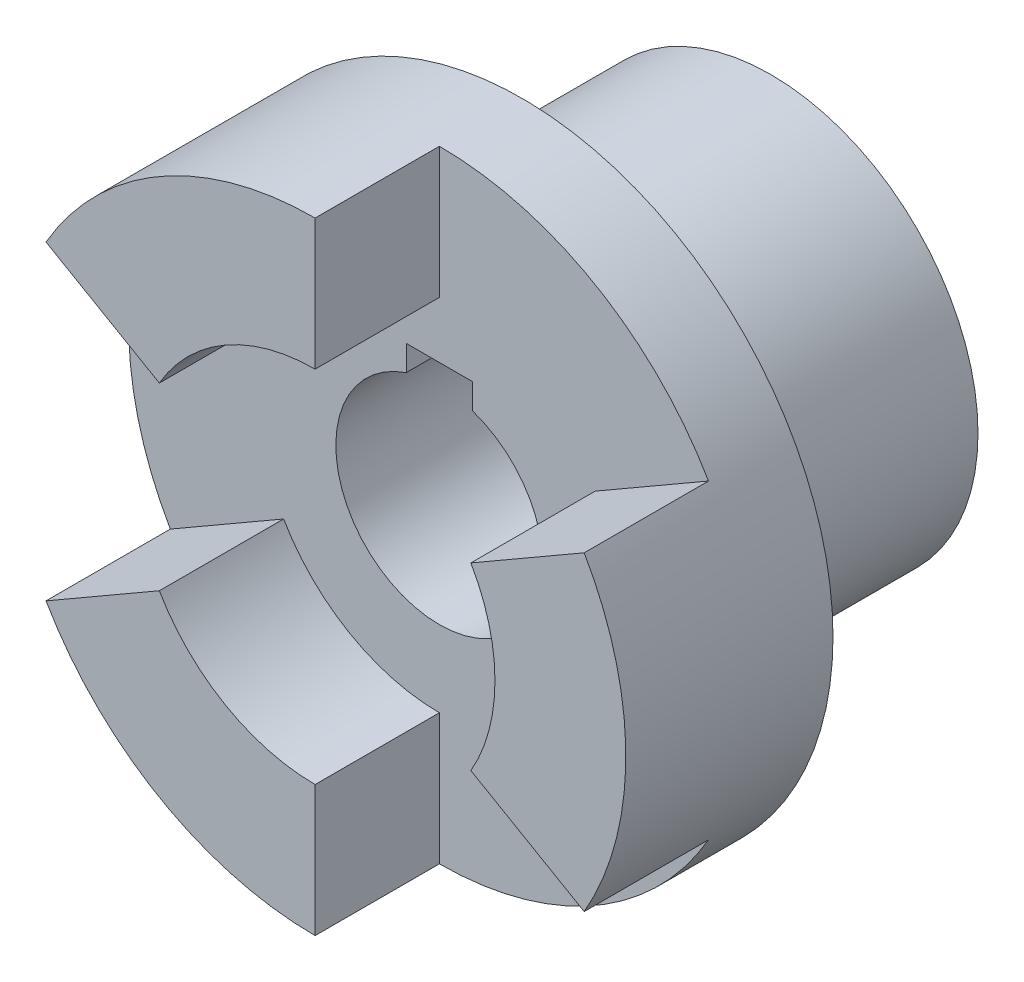
ISO-10303-21;
HEADER;
FILE_DESCRIPTION(('STEP AP214'),'2;1');
FILE_NAME('part.step','',(''),(''),'','','');
FILE_SCHEMA(('AUTOMOTIVE_DESIGN { 1 0 10303 214 1 1 1 1 }'));
ENDSEC;
DATA;
#1=APPLICATION_CONTEXT('core data for automotive mechanical design processes');
#2=APPLICATION_PROTOCOL_DEFINITION('international standard','automotive_design',2000,#1);
#3=PRODUCT_CONTEXT('',#1,'mechanical');
#4=PRODUCT('Part','Part','',(#3));
#5=PRODUCT_RELATED_PRODUCT_CATEGORY('part','',(#4));
#6=PRODUCT_DEFINITION_FORMATION('','',#4);
#7=PRODUCT_DEFINITION_CONTEXT('part definition',#1,'design');
#8=PRODUCT_DEFINITION('design','',#6,#7);
#9=PRODUCT_DEFINITION_SHAPE('','',#8);
#10=(LENGTH_UNIT() NAMED_UNIT(*) SI_UNIT(.MILLI.,.METRE.));
#11=(NAMED_UNIT(*) PLANE_ANGLE_UNIT() SI_UNIT($,.RADIAN.));
#12=(NAMED_UNIT(*) SI_UNIT($,.STERADIAN.) SOLID_ANGLE_UNIT());
#13=UNCERTAINTY_MEASURE_WITH_UNIT(LENGTH_MEASURE(1.E-05),#10,'distance_accuracy_value','');
#14=(GEOMETRIC_REPRESENTATION_CONTEXT(3) GLOBAL_UNCERTAINTY_ASSIGNED_CONTEXT((#13)) GLOBAL_UNIT_ASSIGNED_CONTEXT((#10,
#11,#12)) REPRESENTATION_CONTEXT('',''));
#15=CARTESIAN_POINT('',(0.,0.,0.));
#16=DIRECTION('',(0.,0.,1.));
#17=DIRECTION('',(1.,0.,0.));
#18=AXIS2_PLACEMENT_3D('',#15,#16,#17);
#19=CARTESIAN_POINT('',(0.,0.,0.));
#20=DIRECTION('',(0.,0.,1.));
#21=DIRECTION('',(1.,0.,0.));
#22=AXIS2_PLACEMENT_3D('',#19,#20,#21);
#23=PLANE('',#22);
#24=CARTESIAN_POINT('',(0.,0.,0.));
#25=DIRECTION('',(0.,0.,1.));
#26=DIRECTION('',(1.,0.,0.));
#27=AXIS2_PLACEMENT_3D('',#24,#25,#26);
#28=CIRCLE('',#27,37.5);
#29=CARTESIAN_POINT('',(37.5,0.,0.));
#30=VERTEX_POINT('',#29);
#31=EDGE_CURVE('E276',#30,#30,#28,.T.);
#32=ORIENTED_EDGE('',*,*,#31,.F.);
#33=EDGE_LOOP('',(#32));
#34=FACE_BOUND('',#33,.T.);
#35=CARTESIAN_POINT('',(0.,0.,0.));
#36=DIRECTION('',(0.,0.,1.));
#37=DIRECTION('',(1.,0.,0.));
#38=AXIS2_PLACEMENT_3D('',#35,#36,#37);
#39=CIRCLE('',#38,25.);
#40=CARTESIAN_POINT('',(25.,0.,0.));
#41=VERTEX_POINT('',#40);
#42=EDGE_CURVE('E279',#41,#41,#39,.F.);
#43=ORIENTED_EDGE('',*,*,#42,.F.);
#44=EDGE_LOOP('',(#43));
#45=FACE_BOUND('',#44,.T.);
#46=ADVANCED_FACE('F41',(#34,#45),#23,.F.);
#47=CARTESIAN_POINT('',(0.,0.,10.));
#48=DIRECTION('',(0.,0.,1.));
#49=DIRECTION('',(1.,0.,0.));
#50=AXIS2_PLACEMENT_3D('',#47,#48,#49);
#51=PLANE('',#50);
#52=DIRECTION('',(0.,-1.,0.));
#53=VECTOR('',#52,1.);
#54=CARTESIAN_POINT('',(-4.,0.,10.));
#55=LINE('',#54,#53);
#56=CARTESIAN_POINT('',(-4.,14.9,10.));
#57=VERTEX_POINT('',#56);
#58=CARTESIAN_POINT('',(-4.,11.842719282327,10.));
#59=VERTEX_POINT('',#58);
#60=EDGE_CURVE('E169',#57,#59,#55,.T.);
#61=ORIENTED_EDGE('',*,*,#60,.F.);
#62=DIRECTION('',(1.,0.,0.));
#63=VECTOR('',#62,1.);
#64=CARTESIAN_POINT('',(-4.,14.9,10.));
#65=LINE('',#64,#63);
#66=CARTESIAN_POINT('',(4.,14.9,10.));
#67=VERTEX_POINT('',#66);
#68=EDGE_CURVE('E168',#57,#67,#65,.T.);
#69=ORIENTED_EDGE('',*,*,#68,.T.);
#70=DIRECTION('',(0.,-1.,0.));
#71=VECTOR('',#70,1.);
#72=CARTESIAN_POINT('',(4.,0.,10.));
#73=LINE('',#72,#71);
#74=CARTESIAN_POINT('',(4.,11.842719282327,10.));
#75=VERTEX_POINT('',#74);
#76=EDGE_CURVE('E170',#67,#75,#73,.T.);
#77=ORIENTED_EDGE('',*,*,#76,.T.);
#78=CARTESIAN_POINT('',(0.,0.,10.));
#79=DIRECTION('',(0.,0.,1.));
#80=DIRECTION('',(-1.,0.,0.));
#81=AXIS2_PLACEMENT_3D('',#78,#79,#80);
#82=CIRCLE('',#81,12.5);
#83=EDGE_CURVE('E273',#59,#75,#82,.T.);
#84=ORIENTED_EDGE('',*,*,#83,.F.);
#85=EDGE_LOOP('',(#61,#69,#77,#84));
#86=FACE_BOUND('',#85,.T.);
#87=DIRECTION('',(0.,-1.,0.));
#88=VECTOR('',#87,1.);
#89=CARTESIAN_POINT('',(2.63677968348475E-13,37.5,10.));
#90=LINE('',#89,#88);
#91=CARTESIAN_POINT('',(2.63677968348475E-13,37.5,10.));
#92=VERTEX_POINT('',#91);
#93=CARTESIAN_POINT('',(1.55562953069044E-13,21.7064796758863,10.));
#94=VERTEX_POINT('',#93);
#95=EDGE_CURVE('E64',#92,#94,#90,.T.);
#96=ORIENTED_EDGE('',*,*,#95,.T.);
#97=CARTESIAN_POINT('',(0.,0.,10.));
#98=DIRECTION('',(0.,0.,1.));
#99=DIRECTION('',(1.,0.,0.));
#100=AXIS2_PLACEMENT_3D('',#97,#98,#99);
#101=CIRCLE('',#100,21.7064796758863);
#102=CARTESIAN_POINT('',(-18.7983628260481,10.8532398379432,10.));
#103=VERTEX_POINT('',#102);
#104=EDGE_CURVE('E203',#94,#103,#101,.T.);
#105=ORIENTED_EDGE('',*,*,#104,.T.);
#106=DIRECTION('',(0.866025403784436,-0.500000000000004,0.));
#107=VECTOR('',#106,1.);
#108=CARTESIAN_POINT('',(-32.4759526419164,18.7500000000001,10.));
#109=LINE('',#108,#107);
#110=CARTESIAN_POINT('',(-32.4759526419164,18.7500000000001,10.));
#111=VERTEX_POINT('',#110);
#112=EDGE_CURVE('E200',#111,#103,#109,.T.);
#113=ORIENTED_EDGE('',*,*,#112,.F.);
#114=CARTESIAN_POINT('',(0.,0.,10.));
#115=DIRECTION('',(0.,0.,1.));
#116=DIRECTION('',(1.,0.,0.));
#117=AXIS2_PLACEMENT_3D('',#114,#115,#116);
#118=CIRCLE('',#117,37.5);
#119=CARTESIAN_POINT('',(-32.4759526419165,-18.7499999999999,10.));
#120=VERTEX_POINT('',#119);
#121=EDGE_CURVE('E280',#111,#120,#118,.T.);
#122=ORIENTED_EDGE('',*,*,#121,.T.);
#123=DIRECTION('',(0.86602540378444,0.499999999999998,0.));
#124=VECTOR('',#123,1.);
#125=CARTESIAN_POINT('',(0.,0.,10.));
#126=LINE('',#125,#124);
#127=CARTESIAN_POINT('',(-18.7983628260481,-10.8532398379431,10.));
#128=VERTEX_POINT('',#127);
#129=EDGE_CURVE('E231',#120,#128,#126,.T.);
#130=ORIENTED_EDGE('',*,*,#129,.T.);
#131=CARTESIAN_POINT('',(0.,0.,10.));
#132=DIRECTION('',(0.,0.,1.));
#133=DIRECTION('',(1.,0.,0.));
#134=AXIS2_PLACEMENT_3D('',#131,#132,#133);
#135=CIRCLE('',#134,21.7064796758863);
#136=CARTESIAN_POINT('',(0.,-21.7064796758863,10.));
#137=VERTEX_POINT('',#136);
#138=EDGE_CURVE('E234',#128,#137,#135,.T.);
#139=ORIENTED_EDGE('',*,*,#138,.T.);
#140=DIRECTION('',(0.,1.,0.));
#141=VECTOR('',#140,1.);
#142=CARTESIAN_POINT('',(0.,0.,10.));
#143=LINE('',#142,#141);
#144=CARTESIAN_POINT('',(0.,-37.5,10.));
#145=VERTEX_POINT('',#144);
#146=EDGE_CURVE('E228',#145,#137,#143,.T.);
#147=ORIENTED_EDGE('',*,*,#146,.F.);
#148=CARTESIAN_POINT('',(32.4759526419162,-18.7500000000004,10.));
#149=VERTEX_POINT('',#148);
#150=EDGE_CURVE('E281',#145,#149,#118,.T.);
#151=ORIENTED_EDGE('',*,*,#150,.T.);
#152=DIRECTION('',(-0.866025403784433,0.50000000000001,0.));
#153=VECTOR('',#152,1.);
#154=CARTESIAN_POINT('',(0.,0.,10.));
#155=LINE('',#154,#153);
#156=CARTESIAN_POINT('',(18.798362826048,-10.8532398379433,10.));
#157=VERTEX_POINT('',#156);
#158=EDGE_CURVE('E259',#149,#157,#155,.T.);
#159=ORIENTED_EDGE('',*,*,#158,.T.);
#160=CARTESIAN_POINT('',(0.,0.,10.));
#161=DIRECTION('',(0.,0.,1.));
#162=DIRECTION('',(1.,0.,0.));
#163=AXIS2_PLACEMENT_3D('',#160,#161,#162);
#164=CIRCLE('',#163,21.7064796758863);
#165=CARTESIAN_POINT('',(18.7983628260482,10.853239837943,10.));
#166=VERTEX_POINT('',#165);
#167=EDGE_CURVE('E236',#157,#166,#164,.T.);
#168=ORIENTED_EDGE('',*,*,#167,.T.);
#169=DIRECTION('',(-0.866025403784443,-0.499999999999992,0.));
#170=VECTOR('',#169,1.);
#171=CARTESIAN_POINT('',(0.,0.,10.));
#172=LINE('',#171,#170);
#173=CARTESIAN_POINT('',(32.4759526419166,18.7499999999997,10.));
#174=VERTEX_POINT('',#173);
#175=EDGE_CURVE('E249',#174,#166,#172,.T.);
#176=ORIENTED_EDGE('',*,*,#175,.F.);
#177=EDGE_CURVE('E277',#174,#92,#118,.T.);
#178=ORIENTED_EDGE('',*,*,#177,.T.);
#179=EDGE_LOOP('',(#96,#105,#113,#122,#130,#139,#147,#151,#159,#168,#176,#178));
#180=FACE_BOUND('',#179,.T.);
#181=ADVANCED_FACE('F290',(#86,#180),#51,.T.);
#182=CARTESIAN_POINT('',(0.,0.,10.));
#183=DIRECTION('',(0.,0.,-1.));
#184=DIRECTION('',(-1.,0.,0.));
#185=AXIS2_PLACEMENT_3D('',#182,#183,#184);
#186=CYLINDRICAL_SURFACE('',#185,37.5);
#187=ORIENTED_EDGE('',*,*,#177,.F.);
#188=DIRECTION('',(0.,0.,-1.));
#189=VECTOR('',#188,1.);
#190=CARTESIAN_POINT('',(32.4759526419166,18.7499999999997,25.));
#191=LINE('',#190,#189);
#192=CARTESIAN_POINT('',(32.4759526419166,18.7499999999997,25.));
#193=VERTEX_POINT('',#192);
#194=EDGE_CURVE('E265',#193,#174,#191,.T.);
#195=ORIENTED_EDGE('',*,*,#194,.F.);
#196=CARTESIAN_POINT('',(0.,0.,25.));
#197=DIRECTION('',(0.,0.,1.));
#198=DIRECTION('',(1.,0.,0.));
#199=AXIS2_PLACEMENT_3D('',#196,#197,#198);
#200=CIRCLE('',#199,37.5);
#201=CARTESIAN_POINT('',(32.4759526419162,-18.7500000000004,25.));
#202=VERTEX_POINT('',#201);
#203=EDGE_CURVE('E252',#202,#193,#200,.T.);
#204=ORIENTED_EDGE('',*,*,#203,.F.);
#205=DIRECTION('',(0.,0.,-1.));
#206=VECTOR('',#205,1.);
#207=CARTESIAN_POINT('',(32.4759526419162,-18.7500000000004,25.));
#208=LINE('',#207,#206);
#209=EDGE_CURVE('E267',#202,#149,#208,.T.);
#210=ORIENTED_EDGE('',*,*,#209,.T.);
#211=ORIENTED_EDGE('',*,*,#150,.F.);
#212=DIRECTION('',(0.,0.,-1.));
#213=VECTOR('',#212,1.);
#214=CARTESIAN_POINT('',(0.,-37.5,25.));
#215=LINE('',#214,#213);
#216=CARTESIAN_POINT('',(0.,-37.5,25.));
#217=VERTEX_POINT('',#216);
#218=EDGE_CURVE('E221',#217,#145,#215,.T.);
#219=ORIENTED_EDGE('',*,*,#218,.F.);
#220=CARTESIAN_POINT('',(0.,0.,25.));
#221=DIRECTION('',(0.,0.,1.));
#222=DIRECTION('',(1.,0.,0.));
#223=AXIS2_PLACEMENT_3D('',#220,#221,#222);
#224=CIRCLE('',#223,37.5);
#225=CARTESIAN_POINT('',(-32.4759526419165,-18.7499999999999,25.));
#226=VERTEX_POINT('',#225);
#227=EDGE_CURVE('E238',#226,#217,#224,.T.);
#228=ORIENTED_EDGE('',*,*,#227,.F.);
#229=DIRECTION('',(0.,0.,-1.));
#230=VECTOR('',#229,1.);
#231=CARTESIAN_POINT('',(-32.4759526419165,-18.7499999999999,25.));
#232=LINE('',#231,#230);
#233=EDGE_CURVE('E218',#226,#120,#232,.T.);
#234=ORIENTED_EDGE('',*,*,#233,.T.);
#235=ORIENTED_EDGE('',*,*,#121,.F.);
#236=DIRECTION('',(0.,0.,-1.));
#237=VECTOR('',#236,1.);
#238=CARTESIAN_POINT('',(-32.4759526419164,18.7500000000001,25.));
#239=LINE('',#238,#237);
#240=CARTESIAN_POINT('',(-32.4759526419164,18.7500000000001,25.));
#241=VERTEX_POINT('',#240);
#242=EDGE_CURVE('E195',#241,#111,#239,.T.);
#243=ORIENTED_EDGE('',*,*,#242,.F.);
#244=CARTESIAN_POINT('',(0.,0.,25.));
#245=DIRECTION('',(0.,0.,1.));
#246=DIRECTION('',(1.,0.,0.));
#247=AXIS2_PLACEMENT_3D('',#244,#245,#246);
#248=CIRCLE('',#247,37.5);
#249=CARTESIAN_POINT('',(2.6042306597375E-13,37.5,25.));
#250=VERTEX_POINT('',#249);
#251=EDGE_CURVE('E191',#250,#241,#248,.T.);
#252=ORIENTED_EDGE('',*,*,#251,.F.);
#253=DIRECTION('',(0.,0.,-1.));
#254=VECTOR('',#253,1.);
#255=CARTESIAN_POINT('',(2.6042306597375E-13,37.5,25.));
#256=LINE('',#255,#254);
#257=EDGE_CURVE('E188',#250,#92,#256,.T.);
#258=ORIENTED_EDGE('',*,*,#257,.T.);
#259=EDGE_LOOP('',(#187,#195,#204,#210,#211,#219,#228,#234,#235,#243,#252,#258));
#260=FACE_BOUND('',#259,.T.);
#261=ORIENTED_EDGE('',*,*,#31,.T.);
#262=EDGE_LOOP('',(#261));
#263=FACE_BOUND('',#262,.T.);
#264=ADVANCED_FACE('F43',(#260,#263),#186,.T.);
#265=CARTESIAN_POINT('',(0.,0.,10.));
#266=DIRECTION('',(0.,0.,-1.));
#267=DIRECTION('',(-1.,0.,0.));
#268=AXIS2_PLACEMENT_3D('',#265,#266,#267);
#269=CYLINDRICAL_SURFACE('',#268,12.5);
#270=DIRECTION('',(0.,0.,-1.));
#271=VECTOR('',#270,1.);
#272=CARTESIAN_POINT('',(-4.,11.842719282327,10.));
#273=LINE('',#272,#271);
#274=CARTESIAN_POINT('',(-4.,11.842719282327,-30.));
#275=VERTEX_POINT('',#274);
#276=EDGE_CURVE('E158',#59,#275,#273,.T.);
#277=ORIENTED_EDGE('',*,*,#276,.F.);
#278=ORIENTED_EDGE('',*,*,#83,.T.);
#279=DIRECTION('',(0.,0.,-1.));
#280=VECTOR('',#279,1.);
#281=CARTESIAN_POINT('',(4.,11.842719282327,10.));
#282=LINE('',#281,#280);
#283=CARTESIAN_POINT('',(4.,11.842719282327,-30.));
#284=VERTEX_POINT('',#283);
#285=EDGE_CURVE('E175',#75,#284,#282,.T.);
#286=ORIENTED_EDGE('',*,*,#285,.T.);
#287=CARTESIAN_POINT('',(0.,0.,-30.));
#288=DIRECTION('',(0.,0.,-1.));
#289=DIRECTION('',(-1.,0.,0.));
#290=AXIS2_PLACEMENT_3D('',#287,#288,#289);
#291=CIRCLE('',#290,12.5);
#292=EDGE_CURVE('E183',#284,#275,#291,.T.);
#293=ORIENTED_EDGE('',*,*,#292,.T.);
#294=EDGE_LOOP('',(#277,#278,#286,#293));
#295=FACE_BOUND('',#294,.T.);
#296=ADVANCED_FACE('F299',(#295),#269,.F.);
#297=CARTESIAN_POINT('',(0.,0.,25.));
#298=DIRECTION('',(0.,0.,-1.));
#299=DIRECTION('',(-1.,0.,0.));
#300=AXIS2_PLACEMENT_3D('',#297,#298,#299);
#301=CYLINDRICAL_SURFACE('',#300,21.7064796758863);
#302=ORIENTED_EDGE('',*,*,#167,.F.);
#303=DIRECTION('',(0.,0.,-1.));
#304=VECTOR('',#303,1.);
#305=CARTESIAN_POINT('',(18.798362826048,-10.8532398379433,25.));
#306=LINE('',#305,#304);
#307=CARTESIAN_POINT('',(18.798362826048,-10.8532398379433,25.));
#308=VERTEX_POINT('',#307);
#309=EDGE_CURVE('E270',#308,#157,#306,.T.);
#310=ORIENTED_EDGE('',*,*,#309,.F.);
#311=CARTESIAN_POINT('',(0.,0.,25.));
#312=DIRECTION('',(0.,0.,1.));
#313=DIRECTION('',(1.,0.,0.));
#314=AXIS2_PLACEMENT_3D('',#311,#312,#313);
#315=CIRCLE('',#314,21.7064796758863);
#316=CARTESIAN_POINT('',(18.7983628260482,10.853239837943,25.));
#317=VERTEX_POINT('',#316);
#318=EDGE_CURVE('E245',#308,#317,#315,.T.);
#319=ORIENTED_EDGE('',*,*,#318,.T.);
#320=DIRECTION('',(0.,0.,-1.));
#321=VECTOR('',#320,1.);
#322=CARTESIAN_POINT('',(18.7983628260482,10.853239837943,25.));
#323=LINE('',#322,#321);
#324=EDGE_CURVE('E256',#317,#166,#323,.T.);
#325=ORIENTED_EDGE('',*,*,#324,.T.);
#326=EDGE_LOOP('',(#302,#310,#319,#325));
#327=FACE_BOUND('',#326,.T.);
#328=ADVANCED_FACE('F302',(#327),#301,.F.);
#329=CARTESIAN_POINT('',(0.,0.,25.));
#330=DIRECTION('',(-0.50000000000001,-0.866025403784433,0.));
#331=DIRECTION('',(0.866025403784433,-0.50000000000001,0.));
#332=AXIS2_PLACEMENT_3D('',#329,#330,#331);
#333=PLANE('',#332);
#334=ORIENTED_EDGE('',*,*,#158,.F.);
#335=ORIENTED_EDGE('',*,*,#209,.F.);
#336=DIRECTION('',(-0.866025403784433,0.50000000000001,0.));
#337=VECTOR('',#336,1.);
#338=CARTESIAN_POINT('',(0.,0.,25.));
#339=LINE('',#338,#337);
#340=EDGE_CURVE('E248',#202,#308,#339,.T.);
#341=ORIENTED_EDGE('',*,*,#340,.T.);
#342=ORIENTED_EDGE('',*,*,#309,.T.);
#343=EDGE_LOOP('',(#334,#335,#341,#342));
#344=FACE_BOUND('',#343,.T.);
#345=ADVANCED_FACE('F306',(#344),#333,.T.);
#346=CARTESIAN_POINT('',(0.,0.,25.));
#347=DIRECTION('',(0.499999999999992,-0.866025403784443,0.));
#348=DIRECTION('',(0.866025403784443,0.499999999999992,0.));
#349=AXIS2_PLACEMENT_3D('',#346,#347,#348);
#350=PLANE('',#349);
#351=ORIENTED_EDGE('',*,*,#175,.T.);
#352=ORIENTED_EDGE('',*,*,#324,.F.);
#353=DIRECTION('',(-0.866025403784443,-0.499999999999992,0.));
#354=VECTOR('',#353,1.);
#355=CARTESIAN_POINT('',(0.,0.,25.));
#356=LINE('',#355,#354);
#357=EDGE_CURVE('E254',#193,#317,#356,.T.);
#358=ORIENTED_EDGE('',*,*,#357,.F.);
#359=ORIENTED_EDGE('',*,*,#194,.T.);
#360=EDGE_LOOP('',(#351,#352,#358,#359));
#361=FACE_BOUND('',#360,.T.);
#362=ADVANCED_FACE('F310',(#361),#350,.F.);
#363=CARTESIAN_POINT('',(0.,0.,25.));
#364=DIRECTION('',(0.,0.,1.));
#365=DIRECTION('',(1.,0.,0.));
#366=AXIS2_PLACEMENT_3D('',#363,#364,#365);
#367=PLANE('',#366);
#368=ORIENTED_EDGE('',*,*,#318,.F.);
#369=ORIENTED_EDGE('',*,*,#340,.F.);
#370=ORIENTED_EDGE('',*,*,#203,.T.);
#371=ORIENTED_EDGE('',*,*,#357,.T.);
#372=EDGE_LOOP('',(#368,#369,#370,#371));
#373=FACE_BOUND('',#372,.T.);
#374=ADVANCED_FACE('F314',(#373),#367,.T.);
#375=CARTESIAN_POINT('',(0.,0.,25.));
#376=DIRECTION('',(0.,0.,-1.));
#377=DIRECTION('',(-1.,0.,0.));
#378=AXIS2_PLACEMENT_3D('',#375,#376,#377);
#379=CYLINDRICAL_SURFACE('',#378,21.7064796758863);
#380=ORIENTED_EDGE('',*,*,#138,.F.);
#381=DIRECTION('',(0.,0.,-1.));
#382=VECTOR('',#381,1.);
#383=CARTESIAN_POINT('',(-18.7983628260481,-10.8532398379431,25.));
#384=LINE('',#383,#382);
#385=CARTESIAN_POINT('',(-18.7983628260481,-10.8532398379431,25.));
#386=VERTEX_POINT('',#385);
#387=EDGE_CURVE('E207',#386,#128,#384,.T.);
#388=ORIENTED_EDGE('',*,*,#387,.F.);
#389=CARTESIAN_POINT('',(0.,0.,25.));
#390=DIRECTION('',(0.,0.,1.));
#391=DIRECTION('',(1.,0.,0.));
#392=AXIS2_PLACEMENT_3D('',#389,#390,#391);
#393=CIRCLE('',#392,21.7064796758863);
#394=CARTESIAN_POINT('',(0.,-21.7064796758863,25.));
#395=VERTEX_POINT('',#394);
#396=EDGE_CURVE('E232',#386,#395,#393,.T.);
#397=ORIENTED_EDGE('',*,*,#396,.T.);
#398=DIRECTION('',(0.,0.,-1.));
#399=VECTOR('',#398,1.);
#400=CARTESIAN_POINT('',(0.,-21.7064796758863,25.));
#401=LINE('',#400,#399);
#402=EDGE_CURVE('E224',#395,#137,#401,.T.);
#403=ORIENTED_EDGE('',*,*,#402,.T.);
#404=EDGE_LOOP('',(#380,#388,#397,#403));
#405=FACE_BOUND('',#404,.T.);
#406=ADVANCED_FACE('F318',(#405),#379,.F.);
#407=CARTESIAN_POINT('',(0.,0.,25.));
#408=DIRECTION('',(-0.499999999999998,0.86602540378444,0.));
#409=DIRECTION('',(-0.86602540378444,-0.499999999999998,0.));
#410=AXIS2_PLACEMENT_3D('',#407,#408,#409);
#411=PLANE('',#410);
#412=ORIENTED_EDGE('',*,*,#129,.F.);
#413=ORIENTED_EDGE('',*,*,#233,.F.);
#414=DIRECTION('',(0.86602540378444,0.499999999999998,0.));
#415=VECTOR('',#414,1.);
#416=CARTESIAN_POINT('',(0.,0.,25.));
#417=LINE('',#416,#415);
#418=EDGE_CURVE('E240',#226,#386,#417,.T.);
#419=ORIENTED_EDGE('',*,*,#418,.T.);
#420=ORIENTED_EDGE('',*,*,#387,.T.);
#421=EDGE_LOOP('',(#412,#413,#419,#420));
#422=FACE_BOUND('',#421,.T.);
#423=ADVANCED_FACE('F328',(#422),#411,.T.);
#424=CARTESIAN_POINT('',(0.,0.,25.));
#425=DIRECTION('',(-1.,0.,0.));
#426=DIRECTION('',(0.,0.,1.));
#427=AXIS2_PLACEMENT_3D('',#424,#425,#426);
#428=PLANE('',#427);
#429=ORIENTED_EDGE('',*,*,#146,.T.);
#430=ORIENTED_EDGE('',*,*,#402,.F.);
#431=DIRECTION('',(0.,1.,0.));
#432=VECTOR('',#431,1.);
#433=CARTESIAN_POINT('',(0.,0.,25.));
#434=LINE('',#433,#432);
#435=EDGE_CURVE('E227',#217,#395,#434,.T.);
#436=ORIENTED_EDGE('',*,*,#435,.F.);
#437=ORIENTED_EDGE('',*,*,#218,.T.);
#438=EDGE_LOOP('',(#429,#430,#436,#437));
#439=FACE_BOUND('',#438,.T.);
#440=ADVANCED_FACE('F324',(#439),#428,.F.);
#441=CARTESIAN_POINT('',(0.,0.,25.));
#442=DIRECTION('',(0.,0.,1.));
#443=DIRECTION('',(1.,0.,0.));
#444=AXIS2_PLACEMENT_3D('',#441,#442,#443);
#445=PLANE('',#444);
#446=ORIENTED_EDGE('',*,*,#396,.F.);
#447=ORIENTED_EDGE('',*,*,#418,.F.);
#448=ORIENTED_EDGE('',*,*,#227,.T.);
#449=ORIENTED_EDGE('',*,*,#435,.T.);
#450=EDGE_LOOP('',(#446,#447,#448,#449));
#451=FACE_BOUND('',#450,.T.);
#452=ADVANCED_FACE('F320',(#451),#445,.T.);
#453=CARTESIAN_POINT('',(2.63677968348475E-13,37.5,25.));
#454=DIRECTION('',(1.,0.,0.));
#455=DIRECTION('',(0.,1.,0.));
#456=AXIS2_PLACEMENT_3D('',#453,#454,#455);
#457=PLANE('',#456);
#458=ORIENTED_EDGE('',*,*,#95,.F.);
#459=ORIENTED_EDGE('',*,*,#257,.F.);
#460=DIRECTION('',(0.,-1.,0.));
#461=VECTOR('',#460,1.);
#462=CARTESIAN_POINT('',(2.63677968348475E-13,37.5,25.));
#463=LINE('',#462,#461);
#464=CARTESIAN_POINT('',(1.55562953069044E-13,21.7064796758863,25.));
#465=VERTEX_POINT('',#464);
#466=EDGE_CURVE('E204',#250,#465,#463,.T.);
#467=ORIENTED_EDGE('',*,*,#466,.T.);
#468=DIRECTION('',(0.,0.,-1.));
#469=VECTOR('',#468,1.);
#470=CARTESIAN_POINT('',(1.55562953069044E-13,21.7064796758863,25.));
#471=LINE('',#470,#469);
#472=EDGE_CURVE('E189',#465,#94,#471,.T.);
#473=ORIENTED_EDGE('',*,*,#472,.T.);
#474=EDGE_LOOP('',(#458,#459,#467,#473));
#475=FACE_BOUND('',#474,.T.);
#476=ADVANCED_FACE('F323',(#475),#457,.T.);
#477=CARTESIAN_POINT('',(-32.4759526419164,18.7500000000001,25.));
#478=DIRECTION('',(0.500000000000004,0.866025403784436,0.));
#479=DIRECTION('',(-0.866025403784436,0.500000000000004,0.));
#480=AXIS2_PLACEMENT_3D('',#477,#478,#479);
#481=PLANE('',#480);
#482=ORIENTED_EDGE('',*,*,#112,.T.);
#483=DIRECTION('',(0.,0.,-1.));
#484=VECTOR('',#483,1.);
#485=CARTESIAN_POINT('',(-18.7983628260481,10.8532398379432,25.));
#486=LINE('',#485,#484);
#487=CARTESIAN_POINT('',(-18.7983628260481,10.8532398379432,25.));
#488=VERTEX_POINT('',#487);
#489=EDGE_CURVE('E192',#488,#103,#486,.T.);
#490=ORIENTED_EDGE('',*,*,#489,.F.);
#491=DIRECTION('',(0.866025403784436,-0.500000000000004,0.));
#492=VECTOR('',#491,1.);
#493=CARTESIAN_POINT('',(-32.4759526419164,18.7500000000001,25.));
#494=LINE('',#493,#492);
#495=EDGE_CURVE('E209',#241,#488,#494,.T.);
#496=ORIENTED_EDGE('',*,*,#495,.F.);
#497=ORIENTED_EDGE('',*,*,#242,.T.);
#498=EDGE_LOOP('',(#482,#490,#496,#497));
#499=FACE_BOUND('',#498,.T.);
#500=ADVANCED_FACE('F341',(#499),#481,.F.);
#501=CARTESIAN_POINT('',(0.,0.,25.));
#502=DIRECTION('',(0.,0.,-1.));
#503=DIRECTION('',(-1.,0.,0.));
#504=AXIS2_PLACEMENT_3D('',#501,#502,#503);
#505=CYLINDRICAL_SURFACE('',#504,21.7064796758863);
#506=ORIENTED_EDGE('',*,*,#104,.F.);
#507=ORIENTED_EDGE('',*,*,#472,.F.);
#508=CARTESIAN_POINT('',(0.,0.,25.));
#509=DIRECTION('',(0.,0.,1.));
#510=DIRECTION('',(1.,0.,0.));
#511=AXIS2_PLACEMENT_3D('',#508,#509,#510);
#512=CIRCLE('',#511,21.7064796758863);
#513=EDGE_CURVE('E211',#465,#488,#512,.T.);
#514=ORIENTED_EDGE('',*,*,#513,.T.);
#515=ORIENTED_EDGE('',*,*,#489,.T.);
#516=EDGE_LOOP('',(#506,#507,#514,#515));
#517=FACE_BOUND('',#516,.T.);
#518=ADVANCED_FACE('F339',(#517),#505,.F.);
#519=CARTESIAN_POINT('',(0.,0.,25.));
#520=DIRECTION('',(0.,0.,1.));
#521=DIRECTION('',(1.,0.,0.));
#522=AXIS2_PLACEMENT_3D('',#519,#520,#521);
#523=PLANE('',#522);
#524=ORIENTED_EDGE('',*,*,#466,.F.);
#525=ORIENTED_EDGE('',*,*,#251,.T.);
#526=ORIENTED_EDGE('',*,*,#495,.T.);
#527=ORIENTED_EDGE('',*,*,#513,.F.);
#528=EDGE_LOOP('',(#524,#525,#526,#527));
#529=FACE_BOUND('',#528,.T.);
#530=ADVANCED_FACE('F336',(#529),#523,.T.);
#531=CARTESIAN_POINT('',(0.,0.,-30.));
#532=DIRECTION('',(0.,0.,-1.));
#533=DIRECTION('',(-1.,0.,0.));
#534=AXIS2_PLACEMENT_3D('',#531,#532,#533);
#535=PLANE('',#534);
#536=DIRECTION('',(0.,1.,0.));
#537=VECTOR('',#536,1.);
#538=CARTESIAN_POINT('',(-4.,0.,-30.));
#539=LINE('',#538,#537);
#540=CARTESIAN_POINT('',(-4.,14.5,-30.));
#541=VERTEX_POINT('',#540);
#542=EDGE_CURVE('E11',#275,#541,#539,.T.);
#543=ORIENTED_EDGE('',*,*,#542,.F.);
#544=ORIENTED_EDGE('',*,*,#292,.F.);
#545=DIRECTION('',(0.,1.,0.));
#546=VECTOR('',#545,1.);
#547=CARTESIAN_POINT('',(4.,0.,-30.));
#548=LINE('',#547,#546);
#549=CARTESIAN_POINT('',(4.,14.5,-30.));
#550=VERTEX_POINT('',#549);
#551=EDGE_CURVE('E49',#284,#550,#548,.T.);
#552=ORIENTED_EDGE('',*,*,#551,.T.);
#553=DIRECTION('',(1.,0.,0.));
#554=VECTOR('',#553,1.);
#555=CARTESIAN_POINT('',(-4.,14.5,-30.));
#556=LINE('',#555,#554);
#557=EDGE_CURVE('E165',#541,#550,#556,.T.);
#558=ORIENTED_EDGE('',*,*,#557,.F.);
#559=EDGE_LOOP('',(#543,#544,#552,#558));
#560=FACE_BOUND('',#559,.T.);
#561=CARTESIAN_POINT('',(0.,0.,-30.));
#562=DIRECTION('',(0.,0.,-1.));
#563=DIRECTION('',(-1.,0.,0.));
#564=AXIS2_PLACEMENT_3D('',#561,#562,#563);
#565=CIRCLE('',#564,25.);
#566=CARTESIAN_POINT('',(-25.,0.,-30.));
#567=VERTEX_POINT('',#566);
#568=EDGE_CURVE('E185',#567,#567,#565,.T.);
#569=ORIENTED_EDGE('',*,*,#568,.T.);
#570=EDGE_LOOP('',(#569));
#571=FACE_BOUND('',#570,.T.);
#572=ADVANCED_FACE('F172',(#560,#571),#535,.T.);
#573=CARTESIAN_POINT('',(0.,0.,-30.));
#574=DIRECTION('',(0.,0.,1.));
#575=DIRECTION('',(1.,0.,0.));
#576=AXIS2_PLACEMENT_3D('',#573,#574,#575);
#577=CYLINDRICAL_SURFACE('',#576,25.);
#578=ORIENTED_EDGE('',*,*,#568,.F.);
#579=EDGE_LOOP('',(#578));
#580=FACE_BOUND('',#579,.T.);
#581=ORIENTED_EDGE('',*,*,#42,.T.);
#582=EDGE_LOOP('',(#581));
#583=FACE_BOUND('',#582,.T.);
#584=ADVANCED_FACE('F287',(#580,#583),#577,.T.);
#585=CARTESIAN_POINT('',(-4.,14.9,10.));
#586=DIRECTION('',(0.,0.999950003749688,-0.00999950003749668));
#587=DIRECTION('',(0.,0.00999950003749668,0.999950003749688));
#588=AXIS2_PLACEMENT_3D('',#585,#586,#587);
#589=PLANE('',#588);
#590=DIRECTION('',(0.,0.00999950003749668,0.999950003749687));
#591=VECTOR('',#590,1.);
#592=CARTESIAN_POINT('',(4.,14.9,10.));
#593=LINE('',#592,#591);
#594=EDGE_CURVE('E56',#550,#67,#593,.T.);
#595=ORIENTED_EDGE('',*,*,#594,.T.);
#596=ORIENTED_EDGE('',*,*,#68,.F.);
#597=DIRECTION('',(0.,0.00999950003749668,0.999950003749687));
#598=VECTOR('',#597,1.);
#599=CARTESIAN_POINT('',(-4.,14.9,10.));
#600=LINE('',#599,#598);
#601=EDGE_CURVE('E155',#541,#57,#600,.T.);
#602=ORIENTED_EDGE('',*,*,#601,.F.);
#603=ORIENTED_EDGE('',*,*,#557,.T.);
#604=EDGE_LOOP('',(#595,#596,#602,#603));
#605=FACE_BOUND('',#604,.T.);
#606=ADVANCED_FACE('F164',(#605),#589,.F.);
#607=CARTESIAN_POINT('',(-4.,0.,0.));
#608=DIRECTION('',(-1.,0.,0.));
#609=DIRECTION('',(0.,0.,1.));
#610=AXIS2_PLACEMENT_3D('',#607,#608,#609);
#611=PLANE('',#610);
#612=ORIENTED_EDGE('',*,*,#276,.T.);
#613=ORIENTED_EDGE('',*,*,#542,.T.);
#614=ORIENTED_EDGE('',*,*,#601,.T.);
#615=ORIENTED_EDGE('',*,*,#60,.T.);
#616=EDGE_LOOP('',(#612,#613,#614,#615));
#617=FACE_BOUND('',#616,.T.);
#618=ADVANCED_FACE('F154',(#617),#611,.F.);
#619=CARTESIAN_POINT('',(4.,0.,0.));
#620=DIRECTION('',(-1.,0.,0.));
#621=DIRECTION('',(0.,0.,1.));
#622=AXIS2_PLACEMENT_3D('',#619,#620,#621);
#623=PLANE('',#622);
#624=ORIENTED_EDGE('',*,*,#76,.F.);
#625=ORIENTED_EDGE('',*,*,#594,.F.);
#626=ORIENTED_EDGE('',*,*,#551,.F.);
#627=ORIENTED_EDGE('',*,*,#285,.F.);
#628=EDGE_LOOP('',(#624,#625,#626,#627));
#629=FACE_BOUND('',#628,.T.);
#630=ADVANCED_FACE('F358',(#629),#623,.T.);
#631=CLOSED_SHELL('',(#46,#181,#264,#296,#328,#345,#362,#374,#406,#423,#440,#452,#476,#500,#518,
#530,#572,#584,#606,#618,#630));
#632=MANIFOLD_SOLID_BREP('B2',#631);
#633=ADVANCED_BREP_SHAPE_REPRESENTATION('',(#18,#632),#14);
#634=SHAPE_DEFINITION_REPRESENTATION(#9,#633);
ENDSEC;
END-ISO-10303-21;
